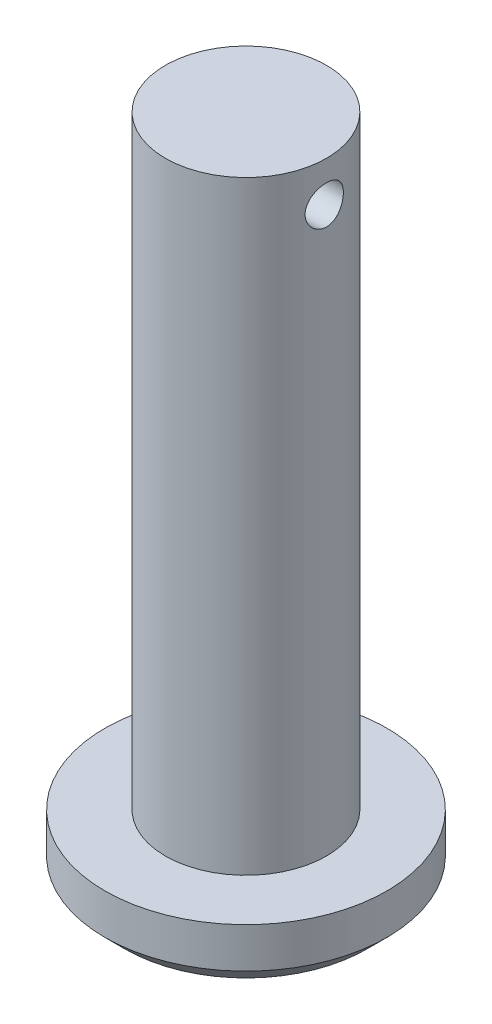
ISO-10303-21;
HEADER;
FILE_DESCRIPTION(('STEP AP214'),'2;1');
FILE_NAME('part.step','',(''),(''),'','','');
FILE_SCHEMA(('AUTOMOTIVE_DESIGN { 1 0 10303 214 1 1 1 1 }'));
ENDSEC;
DATA;
#1=APPLICATION_CONTEXT('core data for automotive mechanical design processes');
#2=APPLICATION_PROTOCOL_DEFINITION('international standard','automotive_design',2000,#1);
#3=PRODUCT_CONTEXT('',#1,'mechanical');
#4=PRODUCT('Part','Part','',(#3));
#5=PRODUCT_RELATED_PRODUCT_CATEGORY('part','',(#4));
#6=PRODUCT_DEFINITION_FORMATION('','',#4);
#7=PRODUCT_DEFINITION_CONTEXT('part definition',#1,'design');
#8=PRODUCT_DEFINITION('design','',#6,#7);
#9=PRODUCT_DEFINITION_SHAPE('','',#8);
#10=(LENGTH_UNIT() NAMED_UNIT(*) SI_UNIT(.MILLI.,.METRE.));
#11=(NAMED_UNIT(*) PLANE_ANGLE_UNIT() SI_UNIT($,.RADIAN.));
#12=(NAMED_UNIT(*) SI_UNIT($,.STERADIAN.) SOLID_ANGLE_UNIT());
#13=UNCERTAINTY_MEASURE_WITH_UNIT(LENGTH_MEASURE(1.E-05),#10,'distance_accuracy_value','');
#14=(GEOMETRIC_REPRESENTATION_CONTEXT(3) GLOBAL_UNCERTAINTY_ASSIGNED_CONTEXT((#13)) GLOBAL_UNIT_ASSIGNED_CONTEXT((#10,
#11,#12)) REPRESENTATION_CONTEXT('',''));
#15=CARTESIAN_POINT('',(0.,0.,0.));
#16=DIRECTION('',(0.,0.,1.));
#17=DIRECTION('',(1.,0.,0.));
#18=AXIS2_PLACEMENT_3D('',#15,#16,#17);
#19=CARTESIAN_POINT('',(0.,-3.,0.));
#20=DIRECTION('',(0.,1.,0.));
#21=DIRECTION('',(0.,0.,1.));
#22=AXIS2_PLACEMENT_3D('',#19,#20,#21);
#23=CYLINDRICAL_SURFACE('',#22,7.);
#24=CARTESIAN_POINT('',(0.,-2.,0.));
#25=DIRECTION('',(0.,1.,0.));
#26=DIRECTION('',(0.,0.,1.));
#27=AXIS2_PLACEMENT_3D('',#24,#25,#26);
#28=CIRCLE('',#27,7.);
#29=CARTESIAN_POINT('',(0.,-2.,7.));
#30=VERTEX_POINT('',#29);
#31=EDGE_CURVE('E41',#30,#30,#28,.T.);
#32=ORIENTED_EDGE('',*,*,#31,.T.);
#33=EDGE_LOOP('',(#32));
#34=FACE_BOUND('',#33,.T.);
#35=CARTESIAN_POINT('',(0.,0.,0.));
#36=DIRECTION('',(0.,1.,0.));
#37=DIRECTION('',(0.,0.,1.));
#38=AXIS2_PLACEMENT_3D('',#35,#36,#37);
#39=CIRCLE('',#38,7.);
#40=CARTESIAN_POINT('',(0.,0.,7.));
#41=VERTEX_POINT('',#40);
#42=EDGE_CURVE('E49',#41,#41,#39,.T.);
#43=ORIENTED_EDGE('',*,*,#42,.F.);
#44=EDGE_LOOP('',(#43));
#45=FACE_BOUND('',#44,.T.);
#46=ADVANCED_FACE('F33',(#34,#45),#23,.T.);
#47=CARTESIAN_POINT('',(0.,-3.,0.));
#48=DIRECTION('',(0.,1.,0.));
#49=DIRECTION('',(0.,0.,1.));
#50=AXIS2_PLACEMENT_3D('',#47,#48,#49);
#51=PLANE('',#50);
#52=CARTESIAN_POINT('',(0.,-3.,0.));
#53=DIRECTION('',(0.,1.,0.));
#54=DIRECTION('',(0.,0.,1.));
#55=AXIS2_PLACEMENT_3D('',#52,#53,#54);
#56=CIRCLE('',#55,6.);
#57=CARTESIAN_POINT('',(0.,-3.,6.));
#58=VERTEX_POINT('',#57);
#59=EDGE_CURVE('E10',#58,#58,#56,.F.);
#60=ORIENTED_EDGE('',*,*,#59,.T.);
#61=EDGE_LOOP('',(#60));
#62=FACE_BOUND('',#61,.T.);
#63=ADVANCED_FACE('F86',(#62),#51,.F.);
#64=CARTESIAN_POINT('',(0.,0.,0.));
#65=DIRECTION('',(0.,1.,0.));
#66=DIRECTION('',(0.,0.,1.));
#67=AXIS2_PLACEMENT_3D('',#64,#65,#66);
#68=PLANE('',#67);
#69=CARTESIAN_POINT('',(0.,0.,0.));
#70=DIRECTION('',(0.,1.,0.));
#71=DIRECTION('',(0.,0.,1.));
#72=AXIS2_PLACEMENT_3D('',#69,#70,#71);
#73=CIRCLE('',#72,4.);
#74=CARTESIAN_POINT('',(0.,0.,4.));
#75=VERTEX_POINT('',#74);
#76=EDGE_CURVE('E45',#75,#75,#73,.T.);
#77=ORIENTED_EDGE('',*,*,#76,.F.);
#78=EDGE_LOOP('',(#77));
#79=FACE_BOUND('',#78,.T.);
#80=ORIENTED_EDGE('',*,*,#42,.T.);
#81=EDGE_LOOP('',(#80));
#82=FACE_BOUND('',#81,.T.);
#83=ADVANCED_FACE('F84',(#79,#82),#68,.T.);
#84=CARTESIAN_POINT('',(0.,30.,0.));
#85=DIRECTION('',(0.,-1.,0.));
#86=DIRECTION('',(0.,0.,-1.));
#87=AXIS2_PLACEMENT_3D('',#84,#85,#86);
#88=CYLINDRICAL_SURFACE('',#87,4.);
#89=CARTESIAN_POINT('',(3.88555015409659,28.,0.95));
#90=CARTESIAN_POINT('',(3.88555119658447,27.9474519607544,0.949998366385796));
#91=CARTESIAN_POINT('',(3.88662777084838,27.8948852272456,0.945625214347678));
#92=CARTESIAN_POINT('',(3.89080804298714,27.7912552200879,0.928272377596757));
#93=CARTESIAN_POINT('',(3.89391303822829,27.7401929305322,0.915287184591518));
#94=CARTESIAN_POINT('',(3.90177911038668,27.6410857472817,0.881149268434963));
#95=CARTESIAN_POINT('',(3.90653818260282,27.5930372837412,0.860006428752924));
#96=CARTESIAN_POINT('',(3.91717372245091,27.5011658444391,0.81018279017899));
#97=CARTESIAN_POINT('',(3.92305020873714,27.4573429392379,0.781501865442132));
#98=CARTESIAN_POINT('',(3.93538912387704,27.3742952291203,0.716807680169346));
#99=CARTESIAN_POINT('',(3.94186015741135,27.3351667582561,0.680672374015558));
#100=CARTESIAN_POINT('',(3.9545841222894,27.2634652450526,0.602358310692677));
#101=CARTESIAN_POINT('',(3.96083703468498,27.2308927710656,0.560179030101745));
#102=CARTESIAN_POINT('',(3.97251482162618,27.1728391235413,0.470320149807632));
#103=CARTESIAN_POINT('',(3.97792835730083,27.1474517721039,0.422578335238789));
#104=CARTESIAN_POINT('',(3.98721966649302,27.1050977880806,0.323355281554747));
#105=CARTESIAN_POINT('',(3.99109764390069,27.0881300374714,0.271874539966053));
#106=CARTESIAN_POINT('',(3.99682007391831,27.0634031703038,0.167638263268294));
#107=CARTESIAN_POINT('',(3.9987005602098,27.0554806783965,0.114923496016068));
#108=CARTESIAN_POINT('',(4.00034139793232,27.0485572312954,0.00888180404807359));
#109=CARTESIAN_POINT('',(4.00010203342113,27.0495550807853,-0.0444450376939748));
#110=CARTESIAN_POINT('',(3.99755726020232,27.0603247533266,-0.149066874564707));
#111=CARTESIAN_POINT('',(3.99529335320897,27.0699203364648,-0.200381171649835));
#112=CARTESIAN_POINT('',(3.98900175091233,27.0973308238776,-0.300649456938194));
#113=CARTESIAN_POINT('',(3.98497396714895,27.1151461403819,-0.349603326627062));
#114=CARTESIAN_POINT('',(3.97554232938614,27.1586384308444,-0.444235754849393));
#115=CARTESIAN_POINT('',(3.97012726618428,27.1843798066072,-0.489883551839135));
#116=CARTESIAN_POINT('',(3.9585111535359,27.2429450236499,-0.576274415240528));
#117=CARTESIAN_POINT('',(3.95230997950376,27.2757699881424,-0.617016702209655));
#118=CARTESIAN_POINT('',(3.93962089598158,27.3485216287455,-0.693490090116479));
#119=CARTESIAN_POINT('',(3.93312968327407,27.3886024466731,-0.729074148815466));
#120=CARTESIAN_POINT('',(3.92073236244736,27.4742304451245,-0.793046400952029));
#121=CARTESIAN_POINT('',(3.9148262764987,27.5197778326329,-0.821434321790253));
#122=CARTESIAN_POINT('',(3.90425726360328,27.6153132627876,-0.870290427474963));
#123=CARTESIAN_POINT('',(3.89959941652524,27.6653183795197,-0.890726398768539));
#124=CARTESIAN_POINT('',(3.89212129602027,27.7681909711268,-0.922857992618092));
#125=CARTESIAN_POINT('',(3.88930067238144,27.8210578984006,-0.934555281006107));
#126=CARTESIAN_POINT('',(3.88588903434823,27.9267980509447,-0.948640150073782));
#127=CARTESIAN_POINT('',(3.8852462915152,27.9796408647193,-0.951243768155169));
#128=CARTESIAN_POINT('',(3.88612290482417,28.0850056667362,-0.947656130744841));
#129=CARTESIAN_POINT('',(3.8876420832732,28.1375276809893,-0.941465598063381));
#130=CARTESIAN_POINT('',(3.89262209093516,28.2399787198995,-0.920654019411596));
#131=CARTESIAN_POINT('',(3.89605458670746,28.2899342245111,-0.906155910822365));
#132=CARTESIAN_POINT('',(3.90444812874248,28.3867064563439,-0.869275695627035));
#133=CARTESIAN_POINT('',(3.90940934212708,28.4335228397095,-0.846892726996901));
#134=CARTESIAN_POINT('',(3.92041218658714,28.5236113722592,-0.79441618935545));
#135=CARTESIAN_POINT('',(3.92647156008142,28.5668051222026,-0.764191829227682));
#136=CARTESIAN_POINT('',(3.93894313562688,28.6475870449842,-0.697058205673845));
#137=CARTESIAN_POINT('',(3.94535538966067,28.6851743889039,-0.660147955508429));
#138=CARTESIAN_POINT('',(3.95798355973407,28.7545364261926,-0.579704501599111));
#139=CARTESIAN_POINT('',(3.96419189239773,28.7861625527976,-0.536041793133141));
#140=CARTESIAN_POINT('',(3.9755635343327,28.8416323468607,-0.443898901350506));
#141=CARTESIAN_POINT('',(3.98072689630454,28.8654764068254,-0.395418961162976));
#142=CARTESIAN_POINT('',(3.98939535866095,28.9045091159305,-0.295342502269508));
#143=CARTESIAN_POINT('',(3.99291186453037,28.9197574503956,-0.243770296419999));
#144=CARTESIAN_POINT('',(3.99794009464609,28.9413484124132,-0.138701882707191));
#145=CARTESIAN_POINT('',(3.99945216577429,28.947692580907,-0.0852060093947521));
#146=CARTESIAN_POINT('',(4.0002885918271,28.9512155843269,0.020789606420507));
#147=CARTESIAN_POINT('',(3.99966552523578,28.9486146886967,0.0732817299154658));
#148=CARTESIAN_POINT('',(3.99641664154496,28.9348210064717,0.177058003591499));
#149=CARTESIAN_POINT('',(3.99379087371965,28.9236284312653,0.228342183460659));
#150=CARTESIAN_POINT('',(3.98683803404943,28.8930822731527,0.328041015431037));
#151=CARTESIAN_POINT('',(3.98251853700102,28.8737649984513,0.376467354169054));
#152=CARTESIAN_POINT('',(3.97263562042283,28.8275514528033,0.46941817761444));
#153=CARTESIAN_POINT('',(3.96707205816221,28.8006543121312,0.513942213796523));
#154=CARTESIAN_POINT('',(3.95515134706186,28.7393534837571,0.598881797617397));
#155=CARTESIAN_POINT('',(3.94877946304627,28.7047980268894,0.639185750890864));
#156=CARTESIAN_POINT('',(3.93603169626298,28.6294609496697,0.713497872024472));
#157=CARTESIAN_POINT('',(3.92965581289578,28.5886777894468,0.747504478179238));
#158=CARTESIAN_POINT('',(3.91750394866502,28.5012381405262,0.808800126119142));
#159=CARTESIAN_POINT('',(3.91173951716314,28.4544963201296,0.835969891162669));
#160=CARTESIAN_POINT('',(3.90161403146148,28.3569799093764,0.882024967652498));
#161=CARTESIAN_POINT('',(3.89725188640608,28.3062084922186,0.900916722837271));
#162=CARTESIAN_POINT('',(3.89115917080241,28.2128867518078,0.926831562053167));
#163=CARTESIAN_POINT('',(3.8890708196325,28.1708095197431,0.935501763545243));
#164=CARTESIAN_POINT('',(3.88626593244295,28.0858256441271,0.947086452900724));
#165=CARTESIAN_POINT('',(3.88554930263575,28.0429190574831,0.950001334268281));
#166=CARTESIAN_POINT('',(3.88555015409659,28.,0.95));
#167=B_SPLINE_CURVE_WITH_KNOTS('',3,(#89,#90,#91,#92,#93,#94,#95,#96,#97,#98,#99,#100,#101,#102,
#103,#104,#105,#106,#107,#108,#109,#110,#111,#112,#113,#114,#115,#116,#117,#118,#119,#120,#121,
#122,#123,#124,#125,#126,#127,#128,#129,#130,#131,#132,#133,#134,#135,#136,#137,#138,#139,#140,
#141,#142,#143,#144,#145,#146,#147,#148,#149,#150,#151,#152,#153,#154,#155,#156,#157,#158,#159,
#160,#161,#162,#163,#164,#165,#166),.UNSPECIFIED.,.T.,.F.,(4,2,2,2,2,2,2,2,2,2,2,2,2,2,2,2,2,2,
2,2,2,2,2,2,2,2,2,2,2,2,2,2,2,2,2,2,2,2,4),(0.,0.157486642863026,0.315074112017906,
0.472471251182707,0.629871018189385,0.790087903096123,0.950318671542176,1.11255417690157,
1.27476813353941,1.43400337941496,1.5932172882576,1.74924039239736,1.90527132213905,
2.06260509144078,2.21996382680072,2.38117364286886,2.54238956486875,2.70425194156268,
2.8660834549805,3.0240431820193,3.18198992675795,3.33765757241444,3.49334224195186,
3.65181238492351,3.81030593484879,3.97233924111705,4.13436437359816,4.29525015428154,
4.45610808888229,4.61303359925174,4.76995524877091,4.92618296476412,5.08242861387175,
5.24210285634097,5.40181664421591,5.5641489688674,5.72635470592196,5.85499205495926,
5.98362060846773),.UNSPECIFIED.);
#168=CARTESIAN_POINT('',(3.88555015409659,28.,0.95));
#169=VERTEX_POINT('',#168);
#170=EDGE_CURVE('E57',#169,#169,#167,.T.);
#171=ORIENTED_EDGE('',*,*,#170,.F.);
#172=EDGE_LOOP('',(#171));
#173=FACE_BOUND('',#172,.T.);
#174=CARTESIAN_POINT('',(-3.88555015409659,28.,0.95));
#175=CARTESIAN_POINT('',(-3.88555119658447,28.0525480392455,0.949998366385796));
#176=CARTESIAN_POINT('',(-3.88662777084838,28.1051147727544,0.945625214347678));
#177=CARTESIAN_POINT('',(-3.89080804298714,28.2087447799121,0.928272377596757));
#178=CARTESIAN_POINT('',(-3.89391303822829,28.2598070694678,0.915287184591518));
#179=CARTESIAN_POINT('',(-3.90177911038668,28.3589142527183,0.881149268434963));
#180=CARTESIAN_POINT('',(-3.90653818260282,28.4069627162588,0.860006428752924));
#181=CARTESIAN_POINT('',(-3.91717372245091,28.4988341555609,0.81018279017899));
#182=CARTESIAN_POINT('',(-3.92305020873714,28.5426570607621,0.781501865442132));
#183=CARTESIAN_POINT('',(-3.93538912387704,28.6257047708797,0.716807680169346));
#184=CARTESIAN_POINT('',(-3.94186015741135,28.6648332417439,0.680672374015558));
#185=CARTESIAN_POINT('',(-3.9545841222894,28.7365347549474,0.602358310692677));
#186=CARTESIAN_POINT('',(-3.96083703468498,28.7691072289344,0.560179030101745));
#187=CARTESIAN_POINT('',(-3.97251482162618,28.8271608764587,0.470320149807632));
#188=CARTESIAN_POINT('',(-3.97792835730083,28.8525482278961,0.422578335238788));
#189=CARTESIAN_POINT('',(-3.98721966649302,28.8949022119194,0.323355281554746));
#190=CARTESIAN_POINT('',(-3.99109764390069,28.9118699625286,0.271874539966052));
#191=CARTESIAN_POINT('',(-3.99682007391831,28.9365968296962,0.167638263268294));
#192=CARTESIAN_POINT('',(-3.9987005602098,28.9445193216035,0.114923496016068));
#193=CARTESIAN_POINT('',(-4.00034139793232,28.9514427687046,0.00888180404807357));
#194=CARTESIAN_POINT('',(-4.00010203342113,28.9504449192147,-0.0444450376939748));
#195=CARTESIAN_POINT('',(-3.99755726020232,28.9396752466734,-0.149066874564707));
#196=CARTESIAN_POINT('',(-3.99529335320897,28.9300796635352,-0.200381171649834));
#197=CARTESIAN_POINT('',(-3.98900175091233,28.9026691761224,-0.300649456938194));
#198=CARTESIAN_POINT('',(-3.98497396714895,28.8848538596181,-0.349603326627062));
#199=CARTESIAN_POINT('',(-3.97554232938614,28.8413615691556,-0.444235754849393));
#200=CARTESIAN_POINT('',(-3.97012726618428,28.8156201933928,-0.489883551839135));
#201=CARTESIAN_POINT('',(-3.9585111535359,28.7570549763501,-0.576274415240528));
#202=CARTESIAN_POINT('',(-3.95230997950376,28.7242300118576,-0.617016702209655));
#203=CARTESIAN_POINT('',(-3.93962089598158,28.6514783712545,-0.693490090116479));
#204=CARTESIAN_POINT('',(-3.93312968327407,28.6113975533269,-0.729074148815466));
#205=CARTESIAN_POINT('',(-3.92073236244736,28.5257695548755,-0.793046400952029));
#206=CARTESIAN_POINT('',(-3.9148262764987,28.4802221673671,-0.821434321790253));
#207=CARTESIAN_POINT('',(-3.90425726360328,28.3846867372124,-0.870290427474963));
#208=CARTESIAN_POINT('',(-3.89959941652524,28.3346816204803,-0.890726398768539));
#209=CARTESIAN_POINT('',(-3.89212129602027,28.2318090288732,-0.922857992618092));
#210=CARTESIAN_POINT('',(-3.88930067238144,28.1789421015994,-0.934555281006107));
#211=CARTESIAN_POINT('',(-3.88588903434823,28.0732019490553,-0.948640150073783));
#212=CARTESIAN_POINT('',(-3.88524629151521,28.0203591352807,-0.951243768155169));
#213=CARTESIAN_POINT('',(-3.88612290482417,27.9149943332638,-0.947656130744841));
#214=CARTESIAN_POINT('',(-3.8876420832732,27.8624723190107,-0.941465598063381));
#215=CARTESIAN_POINT('',(-3.89262209093516,27.7600212801005,-0.920654019411596));
#216=CARTESIAN_POINT('',(-3.89605458670746,27.7100657754889,-0.906155910822365));
#217=CARTESIAN_POINT('',(-3.90444812874248,27.6132935436561,-0.869275695627035));
#218=CARTESIAN_POINT('',(-3.90940934212708,27.5664771602905,-0.846892726996901));
#219=CARTESIAN_POINT('',(-3.92041218658714,27.4763886277408,-0.79441618935545));
#220=CARTESIAN_POINT('',(-3.92647156008142,27.4331948777973,-0.764191829227682));
#221=CARTESIAN_POINT('',(-3.93894313562688,27.3524129550158,-0.697058205673845));
#222=CARTESIAN_POINT('',(-3.94535538966067,27.3148256110961,-0.660147955508429));
#223=CARTESIAN_POINT('',(-3.95798355973407,27.2454635738074,-0.579704501599111));
#224=CARTESIAN_POINT('',(-3.96419189239773,27.2138374472024,-0.536041793133141));
#225=CARTESIAN_POINT('',(-3.9755635343327,27.1583676531393,-0.443898901350506));
#226=CARTESIAN_POINT('',(-3.98072689630454,27.1345235931746,-0.395418961162976));
#227=CARTESIAN_POINT('',(-3.98939535866095,27.0954908840695,-0.295342502269508));
#228=CARTESIAN_POINT('',(-3.99291186453037,27.0802425496044,-0.243770296419998));
#229=CARTESIAN_POINT('',(-3.99794009464609,27.0586515875868,-0.138701882707191));
#230=CARTESIAN_POINT('',(-3.99945216577429,27.052307419093,-0.0852060093947518));
#231=CARTESIAN_POINT('',(-4.0002885918271,27.0487844156731,0.0207896064205069));
#232=CARTESIAN_POINT('',(-3.99966552523578,27.0513853113033,0.0732817299154655));
#233=CARTESIAN_POINT('',(-3.99641664154496,27.0651789935283,0.177058003591499));
#234=CARTESIAN_POINT('',(-3.99379087371965,27.0763715687347,0.228342183460659));
#235=CARTESIAN_POINT('',(-3.98683803404943,27.1069177268473,0.328041015431036));
#236=CARTESIAN_POINT('',(-3.98251853700102,27.1262350015487,0.376467354169051));
#237=CARTESIAN_POINT('',(-3.97263562042283,27.1724485471967,0.469418177614438));
#238=CARTESIAN_POINT('',(-3.96707205816221,27.1993456878688,0.513942213796522));
#239=CARTESIAN_POINT('',(-3.95515134706186,27.2606465162429,0.598881797617397));
#240=CARTESIAN_POINT('',(-3.94877946304627,27.2952019731106,0.639185750890863));
#241=CARTESIAN_POINT('',(-3.93603169626298,27.3705390503303,0.713497872024471));
#242=CARTESIAN_POINT('',(-3.92965581289578,27.4113222105532,0.747504478179237));
#243=CARTESIAN_POINT('',(-3.91750394866502,27.4987618594738,0.808800126119143));
#244=CARTESIAN_POINT('',(-3.91173951716314,27.5455036798704,0.83596989116267));
#245=CARTESIAN_POINT('',(-3.90161403146148,27.6430200906236,0.882024967652499));
#246=CARTESIAN_POINT('',(-3.89725188640608,27.6937915077814,0.900916722837272));
#247=CARTESIAN_POINT('',(-3.89115917080241,27.7871132481922,0.926831562053167));
#248=CARTESIAN_POINT('',(-3.8890708196325,27.8291904802568,0.935501763545243));
#249=CARTESIAN_POINT('',(-3.88626593244295,27.9141743558729,0.947086452900724));
#250=CARTESIAN_POINT('',(-3.88554930263575,27.9570809425169,0.950001334268281));
#251=CARTESIAN_POINT('',(-3.88555015409659,28.,0.95));
#252=B_SPLINE_CURVE_WITH_KNOTS('',3,(#174,#175,#176,#177,#178,#179,#180,#181,#182,#183,#184,
#185,#186,#187,#188,#189,#190,#191,#192,#193,#194,#195,#196,#197,#198,#199,#200,#201,#202,#203,
#204,#205,#206,#207,#208,#209,#210,#211,#212,#213,#214,#215,#216,#217,#218,#219,#220,#221,#222,
#223,#224,#225,#226,#227,#228,#229,#230,#231,#232,#233,#234,#235,#236,#237,#238,#239,#240,#241,
#242,#243,#244,#245,#246,#247,#248,#249,#250,#251),.UNSPECIFIED.,.T.,.F.,(4,2,2,2,2,2,2,2,2,2,2,
2,2,2,2,2,2,2,2,2,2,2,2,2,2,2,2,2,2,2,2,2,2,2,2,2,2,2,4),(0.,0.157486642863026,
0.315074112017906,0.472471251182707,0.629871018189385,0.790087903096123,0.950318671542176,
1.11255417690157,1.27476813353941,1.43400337941496,1.5932172882576,1.74924039239736,
1.90527132213905,2.06260509144078,2.21996382680072,2.38117364286886,2.54238956486875,
2.70425194156267,2.8660834549805,3.0240431820193,3.18198992675795,3.33765757241444,
3.49334224195186,3.65181238492351,3.81030593484879,3.97233924111705,4.13436437359816,
4.29525015428154,4.45610808888229,4.61303359925174,4.76995524877091,4.92618296476412,
5.08242861387175,5.24210285634097,5.40181664421591,5.5641489688674,5.72635470592196,
5.85499205495926,5.98362060846773),.UNSPECIFIED.);
#253=CARTESIAN_POINT('',(-3.88555015409659,28.,0.95));
#254=VERTEX_POINT('',#253);
#255=EDGE_CURVE('E65',#254,#254,#252,.T.);
#256=ORIENTED_EDGE('',*,*,#255,.F.);
#257=EDGE_LOOP('',(#256));
#258=FACE_BOUND('',#257,.T.);
#259=CARTESIAN_POINT('',(0.,30.,0.));
#260=DIRECTION('',(0.,1.,0.));
#261=DIRECTION('',(0.,0.,1.));
#262=AXIS2_PLACEMENT_3D('',#259,#260,#261);
#263=CIRCLE('',#262,4.);
#264=CARTESIAN_POINT('',(0.,30.,4.));
#265=VERTEX_POINT('',#264);
#266=EDGE_CURVE('E53',#265,#265,#263,.T.);
#267=ORIENTED_EDGE('',*,*,#266,.F.);
#268=EDGE_LOOP('',(#267));
#269=FACE_BOUND('',#268,.T.);
#270=ORIENTED_EDGE('',*,*,#76,.T.);
#271=EDGE_LOOP('',(#270));
#272=FACE_BOUND('',#271,.T.);
#273=ADVANCED_FACE('F80',(#173,#258,#269,#272),#88,.T.);
#274=CARTESIAN_POINT('',(0.,30.,0.));
#275=DIRECTION('',(0.,1.,0.));
#276=DIRECTION('',(0.,0.,1.));
#277=AXIS2_PLACEMENT_3D('',#274,#275,#276);
#278=PLANE('',#277);
#279=ORIENTED_EDGE('',*,*,#266,.T.);
#280=EDGE_LOOP('',(#279));
#281=FACE_BOUND('',#280,.T.);
#282=ADVANCED_FACE('F76',(#281),#278,.T.);
#283=CARTESIAN_POINT('',(0.,-2.,0.));
#284=DIRECTION('',(0.,1.,0.));
#285=DIRECTION('',(0.,0.,1.));
#286=AXIS2_PLACEMENT_3D('',#283,#284,#285);
#287=CONICAL_SURFACE('',#286,7.,0.78539816339745);
#288=ORIENTED_EDGE('',*,*,#59,.F.);
#289=EDGE_LOOP('',(#288));
#290=FACE_BOUND('',#289,.T.);
#291=ORIENTED_EDGE('',*,*,#31,.F.);
#292=EDGE_LOOP('',(#291));
#293=FACE_BOUND('',#292,.T.);
#294=ADVANCED_FACE('F36',(#290,#293),#287,.T.);
#295=CARTESIAN_POINT('',(7.001,28.,0.));
#296=DIRECTION('',(-1.,0.,0.));
#297=DIRECTION('',(0.,0.,1.));
#298=AXIS2_PLACEMENT_3D('',#295,#296,#297);
#299=CYLINDRICAL_SURFACE('',#298,0.95);
#300=ORIENTED_EDGE('',*,*,#255,.T.);
#301=EDGE_LOOP('',(#300));
#302=FACE_BOUND('',#301,.T.);
#303=ORIENTED_EDGE('',*,*,#170,.T.);
#304=EDGE_LOOP('',(#303));
#305=FACE_BOUND('',#304,.T.);
#306=ADVANCED_FACE('F69',(#302,#305),#299,.F.);
#307=CLOSED_SHELL('',(#46,#63,#83,#273,#282,#294,#306));
#308=MANIFOLD_SOLID_BREP('B2',#307);
#309=ADVANCED_BREP_SHAPE_REPRESENTATION('',(#18,#308),#14);
#310=SHAPE_DEFINITION_REPRESENTATION(#9,#309);
ENDSEC;
END-ISO-10303-21;
